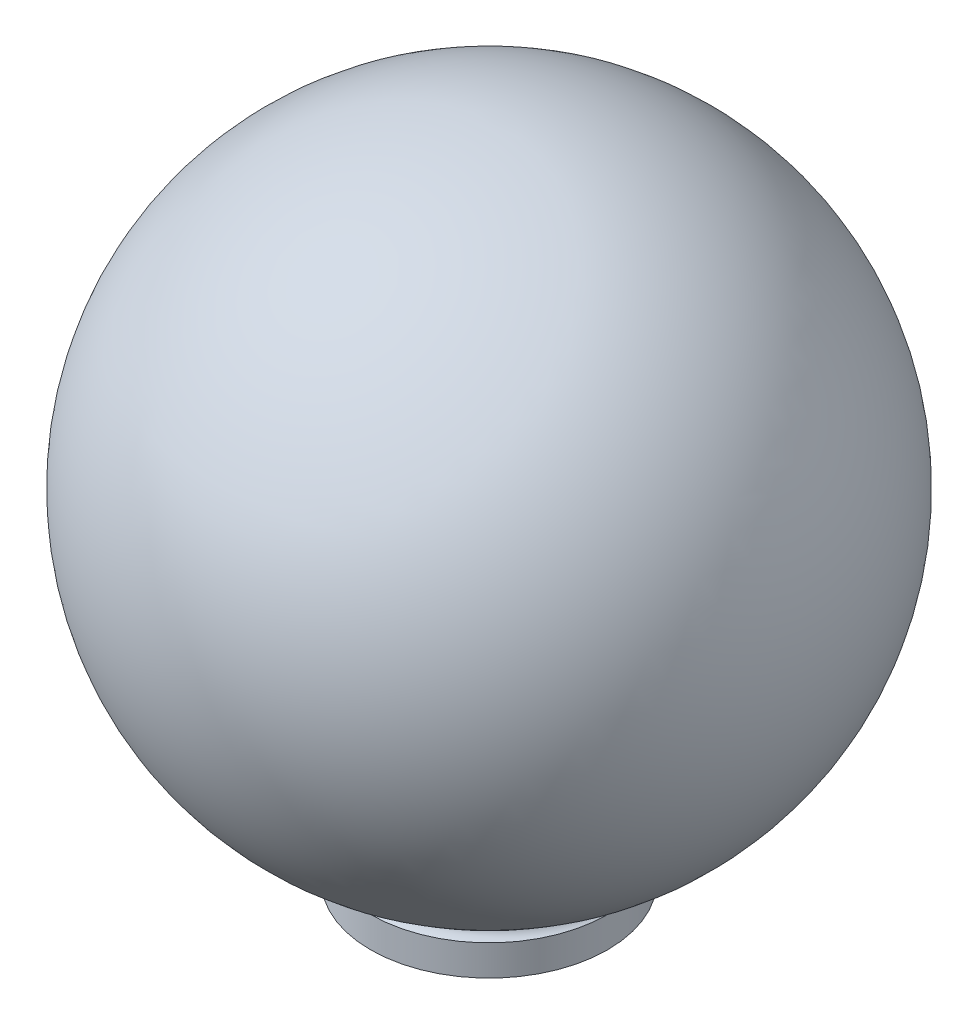
ISO-10303-21;
HEADER;
FILE_DESCRIPTION(('STEP AP214'),'2;1');
FILE_NAME('part.step','',(''),(''),'','','');
FILE_SCHEMA(('AUTOMOTIVE_DESIGN { 1 0 10303 214 1 1 1 1 }'));
ENDSEC;
DATA;
#1=APPLICATION_CONTEXT('core data for automotive mechanical design processes');
#2=APPLICATION_PROTOCOL_DEFINITION('international standard','automotive_design',2000,#1);
#3=PRODUCT_CONTEXT('',#1,'mechanical');
#4=PRODUCT('Part','Part','',(#3));
#5=PRODUCT_RELATED_PRODUCT_CATEGORY('part','',(#4));
#6=PRODUCT_DEFINITION_FORMATION('','',#4);
#7=PRODUCT_DEFINITION_CONTEXT('part definition',#1,'design');
#8=PRODUCT_DEFINITION('design','',#6,#7);
#9=PRODUCT_DEFINITION_SHAPE('','',#8);
#10=(LENGTH_UNIT() NAMED_UNIT(*) SI_UNIT(.MILLI.,.METRE.));
#11=(NAMED_UNIT(*) PLANE_ANGLE_UNIT() SI_UNIT($,.RADIAN.));
#12=(NAMED_UNIT(*) SI_UNIT($,.STERADIAN.) SOLID_ANGLE_UNIT());
#13=UNCERTAINTY_MEASURE_WITH_UNIT(LENGTH_MEASURE(1.E-05),#10,'distance_accuracy_value','');
#14=(GEOMETRIC_REPRESENTATION_CONTEXT(3) GLOBAL_UNCERTAINTY_ASSIGNED_CONTEXT((#13)) GLOBAL_UNIT_ASSIGNED_CONTEXT((#10,
#11,#12)) REPRESENTATION_CONTEXT('',''));
#15=CARTESIAN_POINT('',(0.,0.,0.));
#16=DIRECTION('',(0.,0.,1.));
#17=DIRECTION('',(1.,0.,0.));
#18=AXIS2_PLACEMENT_3D('',#15,#16,#17);
#19=CARTESIAN_POINT('',(0.,138.148086015469,0.));
#20=DIRECTION('',(0.,-1.,0.));
#21=DIRECTION('',(1.,0.,0.));
#22=AXIS2_PLACEMENT_3D('',#19,#20,#21);
#23=SPHERICAL_SURFACE('',#22,127.);
#24=CARTESIAN_POINT('',(0.,19.96,0.));
#25=DIRECTION('',(0.,-1.,0.));
#26=DIRECTION('',(0.,0.,-1.));
#27=AXIS2_PLACEMENT_3D('',#24,#25,#26);
#28=CIRCLE('',#27,46.482);
#29=CARTESIAN_POINT('',(0.,19.96,-46.482));
#30=VERTEX_POINT('',#29);
#31=EDGE_CURVE('E60',#30,#30,#28,.T.);
#32=ORIENTED_EDGE('',*,*,#31,.F.);
#33=EDGE_LOOP('',(#32));
#34=FACE_BOUND('',#33,.T.);
#35=ADVANCED_FACE('F37',(#34),#23,.T.);
#36=CARTESIAN_POINT('',(0.,138.148086015469,0.));
#37=DIRECTION('',(0.,-1.,0.));
#38=DIRECTION('',(1.,0.,0.));
#39=AXIS2_PLACEMENT_3D('',#36,#37,#38);
#40=SPHERICAL_SURFACE('',#39,126.092517779605);
#41=CARTESIAN_POINT('',(0.,19.96,0.));
#42=DIRECTION('',(0.,-1.,0.));
#43=DIRECTION('',(0.,0.,-1.));
#44=AXIS2_PLACEMENT_3D('',#41,#42,#43);
#45=CIRCLE('',#44,43.9419999999999);
#46=CARTESIAN_POINT('',(0.,19.96,-43.9419999999999));
#47=VERTEX_POINT('',#46);
#48=EDGE_CURVE('E10',#47,#47,#45,.T.);
#49=ORIENTED_EDGE('',*,*,#48,.T.);
#50=EDGE_LOOP('',(#49));
#51=FACE_BOUND('',#50,.T.);
#52=ADVANCED_FACE('F69',(#51),#40,.F.);
#53=CARTESIAN_POINT('',(0.,0.,0.));
#54=DIRECTION('',(0.,-1.,0.));
#55=DIRECTION('',(0.,0.,-1.));
#56=AXIS2_PLACEMENT_3D('',#53,#54,#55);
#57=CYLINDRICAL_SURFACE('',#56,43.942);
#58=ORIENTED_EDGE('',*,*,#48,.F.);
#59=EDGE_LOOP('',(#58));
#60=FACE_BOUND('',#59,.T.);
#61=CARTESIAN_POINT('',(0.,0.,0.));
#62=DIRECTION('',(0.,-1.,0.));
#63=DIRECTION('',(0.,0.,-1.));
#64=AXIS2_PLACEMENT_3D('',#61,#62,#63);
#65=CIRCLE('',#64,43.942);
#66=CARTESIAN_POINT('',(0.,0.,-43.942));
#67=VERTEX_POINT('',#66);
#68=EDGE_CURVE('E44',#67,#67,#65,.T.);
#69=ORIENTED_EDGE('',*,*,#68,.T.);
#70=EDGE_LOOP('',(#69));
#71=FACE_BOUND('',#70,.T.);
#72=ADVANCED_FACE('F73',(#60,#71),#57,.F.);
#73=CARTESIAN_POINT('',(43.942,0.,0.));
#74=DIRECTION('',(0.,-1.,0.));
#75=DIRECTION('',(0.,0.,-1.));
#76=AXIS2_PLACEMENT_3D('',#73,#74,#75);
#77=PLANE('',#76);
#78=CARTESIAN_POINT('',(0.,0.,0.));
#79=DIRECTION('',(0.,-1.,0.));
#80=DIRECTION('',(0.,0.,-1.));
#81=AXIS2_PLACEMENT_3D('',#78,#79,#80);
#82=CIRCLE('',#81,48.133);
#83=CARTESIAN_POINT('',(0.,0.,-48.133));
#84=VERTEX_POINT('',#83);
#85=EDGE_CURVE('E49',#84,#84,#82,.T.);
#86=ORIENTED_EDGE('',*,*,#85,.T.);
#87=EDGE_LOOP('',(#86));
#88=FACE_BOUND('',#87,.T.);
#89=ORIENTED_EDGE('',*,*,#68,.F.);
#90=EDGE_LOOP('',(#89));
#91=FACE_BOUND('',#90,.T.);
#92=ADVANCED_FACE('F77',(#88,#91),#77,.T.);
#93=CARTESIAN_POINT('',(0.,0.,0.));
#94=DIRECTION('',(0.,-1.,0.));
#95=DIRECTION('',(0.,0.,-1.));
#96=AXIS2_PLACEMENT_3D('',#93,#94,#95);
#97=CYLINDRICAL_SURFACE('',#96,48.133);
#98=CARTESIAN_POINT('',(0.,12.4072246072722,0.));
#99=DIRECTION('',(0.,-1.,0.));
#100=DIRECTION('',(0.,0.,-1.));
#101=AXIS2_PLACEMENT_3D('',#98,#99,#100);
#102=CIRCLE('',#101,48.133);
#103=CARTESIAN_POINT('',(0.,12.4072246072722,-48.133));
#104=VERTEX_POINT('',#103);
#105=EDGE_CURVE('E54',#104,#104,#102,.T.);
#106=ORIENTED_EDGE('',*,*,#105,.T.);
#107=EDGE_LOOP('',(#106));
#108=FACE_BOUND('',#107,.T.);
#109=ORIENTED_EDGE('',*,*,#85,.F.);
#110=EDGE_LOOP('',(#109));
#111=FACE_BOUND('',#110,.T.);
#112=ADVANCED_FACE('F83',(#108,#111),#97,.T.);
#113=CARTESIAN_POINT('',(0.,16.9705656841468,0.));
#114=DIRECTION('',(0.,-1.,0.));
#115=DIRECTION('',(0.,0.,-1.));
#116=AXIS2_PLACEMENT_3D('',#113,#114,#115);
#117=TOROIDAL_SURFACE('',#116,50.9075497441218,5.34061869697675);
#118=ORIENTED_EDGE('',*,*,#31,.T.);
#119=EDGE_LOOP('',(#118));
#120=FACE_BOUND('',#119,.T.);
#121=ORIENTED_EDGE('',*,*,#105,.F.);
#122=EDGE_LOOP('',(#121));
#123=FACE_BOUND('',#122,.T.);
#124=ADVANCED_FACE('F65',(#120,#123),#117,.F.);
#125=CLOSED_SHELL('',(#35,#52,#72,#92,#112,#124));
#126=MANIFOLD_SOLID_BREP('B2',#125);
#127=ADVANCED_BREP_SHAPE_REPRESENTATION('',(#18,#126),#14);
#128=SHAPE_DEFINITION_REPRESENTATION(#9,#127);
ENDSEC;
END-ISO-10303-21;
